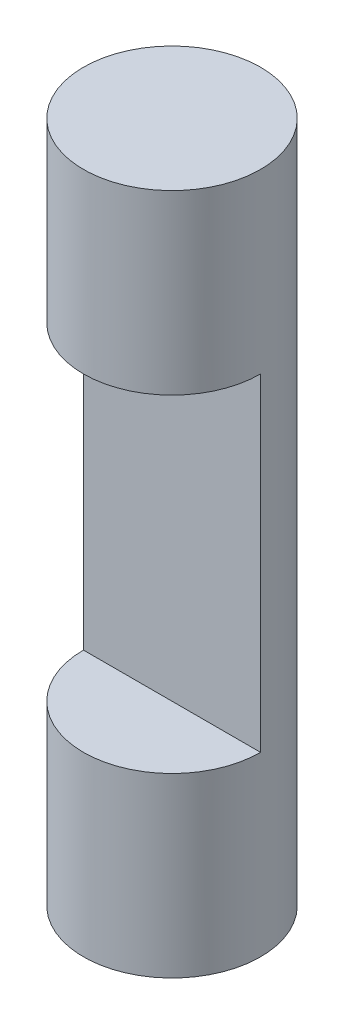
ISO-10303-21;
HEADER;
FILE_DESCRIPTION(('STEP AP214'),'2;1');
FILE_NAME('part.step','',(''),(''),'','','');
FILE_SCHEMA(('AUTOMOTIVE_DESIGN { 1 0 10303 214 1 1 1 1 }'));
ENDSEC;
DATA;
#1=APPLICATION_CONTEXT('core data for automotive mechanical design processes');
#2=APPLICATION_PROTOCOL_DEFINITION('international standard','automotive_design',2000,#1);
#3=PRODUCT_CONTEXT('',#1,'mechanical');
#4=PRODUCT('Part','Part','',(#3));
#5=PRODUCT_RELATED_PRODUCT_CATEGORY('part','',(#4));
#6=PRODUCT_DEFINITION_FORMATION('','',#4);
#7=PRODUCT_DEFINITION_CONTEXT('part definition',#1,'design');
#8=PRODUCT_DEFINITION('design','',#6,#7);
#9=PRODUCT_DEFINITION_SHAPE('','',#8);
#10=(LENGTH_UNIT() NAMED_UNIT(*) SI_UNIT(.MILLI.,.METRE.));
#11=(NAMED_UNIT(*) PLANE_ANGLE_UNIT() SI_UNIT($,.RADIAN.));
#12=(NAMED_UNIT(*) SI_UNIT($,.STERADIAN.) SOLID_ANGLE_UNIT());
#13=UNCERTAINTY_MEASURE_WITH_UNIT(LENGTH_MEASURE(1.E-05),#10,'distance_accuracy_value','');
#14=(GEOMETRIC_REPRESENTATION_CONTEXT(3) GLOBAL_UNCERTAINTY_ASSIGNED_CONTEXT((#13)) GLOBAL_UNIT_ASSIGNED_CONTEXT((#10,
#11,#12)) REPRESENTATION_CONTEXT('',''));
#15=CARTESIAN_POINT('',(0.,0.,0.));
#16=DIRECTION('',(0.,0.,1.));
#17=DIRECTION('',(1.,0.,0.));
#18=AXIS2_PLACEMENT_3D('',#15,#16,#17);
#19=CARTESIAN_POINT('',(0.,33.6284271247462,-11.));
#20=DIRECTION('',(0.,-1.,0.));
#21=DIRECTION('',(0.,0.,-1.));
#22=AXIS2_PLACEMENT_3D('',#19,#20,#21);
#23=CYLINDRICAL_SURFACE('',#22,1.);
#24=CARTESIAN_POINT('',(0.,6.7,-11.));
#25=DIRECTION('',(0.,-1.,0.));
#26=DIRECTION('',(0.,0.,-1.));
#27=AXIS2_PLACEMENT_3D('',#24,#25,#26);
#28=CIRCLE('',#27,1.);
#29=CARTESIAN_POINT('',(0.,6.7,-12.));
#30=VERTEX_POINT('',#29);
#31=EDGE_CURVE('E39',#30,#30,#28,.T.);
#32=ORIENTED_EDGE('',*,*,#31,.T.);
#33=EDGE_LOOP('',(#32));
#34=FACE_BOUND('',#33,.T.);
#35=CARTESIAN_POINT('',(0.,4.7,-11.));
#36=DIRECTION('',(0.,-1.,0.));
#37=DIRECTION('',(0.,0.,-1.));
#38=AXIS2_PLACEMENT_3D('',#35,#36,#37);
#39=CIRCLE('',#38,1.);
#40=CARTESIAN_POINT('',(1.,4.7,-11.));
#41=VERTEX_POINT('',#40);
#42=CARTESIAN_POINT('',(-1.,4.7,-11.));
#43=VERTEX_POINT('',#42);
#44=EDGE_CURVE('E66',#41,#43,#39,.T.);
#45=ORIENTED_EDGE('',*,*,#44,.F.);
#46=DIRECTION('',(0.,-1.,0.));
#47=VECTOR('',#46,1.);
#48=CARTESIAN_POINT('',(1.,33.6284271247462,-11.));
#49=LINE('',#48,#47);
#50=CARTESIAN_POINT('',(1.,1.,-11.));
#51=VERTEX_POINT('',#50);
#52=EDGE_CURVE('E12',#41,#51,#49,.T.);
#53=ORIENTED_EDGE('',*,*,#52,.T.);
#54=CARTESIAN_POINT('',(0.,1.,-11.));
#55=DIRECTION('',(0.,-1.,0.));
#56=DIRECTION('',(0.,0.,-1.));
#57=AXIS2_PLACEMENT_3D('',#54,#55,#56);
#58=CIRCLE('',#57,1.00000000000001);
#59=CARTESIAN_POINT('',(-1.00000000000001,1.,-11.));
#60=VERTEX_POINT('',#59);
#61=EDGE_CURVE('E71',#51,#60,#58,.T.);
#62=ORIENTED_EDGE('',*,*,#61,.T.);
#63=DIRECTION('',(0.,-1.,0.));
#64=VECTOR('',#63,1.);
#65=CARTESIAN_POINT('',(-1.,33.6284271247462,-11.));
#66=LINE('',#65,#64);
#67=EDGE_CURVE('E44',#60,#43,#66,.F.);
#68=ORIENTED_EDGE('',*,*,#67,.T.);
#69=EDGE_LOOP('',(#45,#53,#62,#68));
#70=FACE_BOUND('',#69,.T.);
#71=CARTESIAN_POINT('',(0.,-1.,-11.));
#72=DIRECTION('',(0.,-1.,0.));
#73=DIRECTION('',(0.,0.,-1.));
#74=AXIS2_PLACEMENT_3D('',#71,#72,#73);
#75=CIRCLE('',#74,1.00000000000001);
#76=CARTESIAN_POINT('',(0.,-1.,-12.));
#77=VERTEX_POINT('',#76);
#78=EDGE_CURVE('E74',#77,#77,#75,.T.);
#79=ORIENTED_EDGE('',*,*,#78,.F.);
#80=EDGE_LOOP('',(#79));
#81=FACE_BOUND('',#80,.T.);
#82=ADVANCED_FACE('F36',(#34,#70,#81),#23,.T.);
#83=CARTESIAN_POINT('',(-11.,1.,-11.));
#84=DIRECTION('',(0.,0.,-1.));
#85=DIRECTION('',(-1.,0.,0.));
#86=AXIS2_PLACEMENT_3D('',#83,#84,#85);
#87=PLANE('',#86);
#88=DIRECTION('',(-1.,0.,0.));
#89=VECTOR('',#88,1.);
#90=CARTESIAN_POINT('',(-11.,4.7,-11.));
#91=LINE('',#90,#89);
#92=EDGE_CURVE('E50',#41,#43,#91,.T.);
#93=ORIENTED_EDGE('',*,*,#92,.T.);
#94=ORIENTED_EDGE('',*,*,#67,.F.);
#95=DIRECTION('',(-1.,0.,0.));
#96=VECTOR('',#95,1.);
#97=CARTESIAN_POINT('',(-11.,1.,-11.));
#98=LINE('',#97,#96);
#99=EDGE_CURVE('E57',#51,#60,#98,.T.);
#100=ORIENTED_EDGE('',*,*,#99,.F.);
#101=ORIENTED_EDGE('',*,*,#52,.F.);
#102=EDGE_LOOP('',(#93,#94,#100,#101));
#103=FACE_BOUND('',#102,.T.);
#104=ADVANCED_FACE('F62',(#103),#87,.F.);
#105=CARTESIAN_POINT('',(0.,4.7,0.));
#106=DIRECTION('',(0.,-1.,0.));
#107=DIRECTION('',(0.,0.,-1.));
#108=AXIS2_PLACEMENT_3D('',#105,#106,#107);
#109=PLANE('',#108);
#110=ORIENTED_EDGE('',*,*,#44,.T.);
#111=ORIENTED_EDGE('',*,*,#92,.F.);
#112=EDGE_LOOP('',(#110,#111));
#113=FACE_BOUND('',#112,.T.);
#114=ADVANCED_FACE('F81',(#113),#109,.T.);
#115=CARTESIAN_POINT('',(0.,1.,-11.));
#116=DIRECTION('',(0.,-1.,0.));
#117=DIRECTION('',(0.,0.,-1.));
#118=AXIS2_PLACEMENT_3D('',#115,#116,#117);
#119=PLANE('',#118);
#120=ORIENTED_EDGE('',*,*,#61,.F.);
#121=ORIENTED_EDGE('',*,*,#99,.T.);
#122=EDGE_LOOP('',(#120,#121));
#123=FACE_BOUND('',#122,.T.);
#124=ADVANCED_FACE('F70',(#123),#119,.F.);
#125=CARTESIAN_POINT('',(0.,-1.,-11.));
#126=DIRECTION('',(0.,-1.,0.));
#127=DIRECTION('',(0.,0.,-1.));
#128=AXIS2_PLACEMENT_3D('',#125,#126,#127);
#129=PLANE('',#128);
#130=ORIENTED_EDGE('',*,*,#78,.T.);
#131=EDGE_LOOP('',(#130));
#132=FACE_BOUND('',#131,.T.);
#133=ADVANCED_FACE('F88',(#132),#129,.T.);
#134=CARTESIAN_POINT('',(0.,6.7,0.));
#135=DIRECTION('',(0.,-1.,0.));
#136=DIRECTION('',(0.,0.,-1.));
#137=AXIS2_PLACEMENT_3D('',#134,#135,#136);
#138=PLANE('',#137);
#139=ORIENTED_EDGE('',*,*,#31,.F.);
#140=EDGE_LOOP('',(#139));
#141=FACE_BOUND('',#140,.T.);
#142=ADVANCED_FACE('F96',(#141),#138,.F.);
#143=CLOSED_SHELL('',(#82,#104,#114,#124,#133,#142));
#144=MANIFOLD_SOLID_BREP('B2',#143);
#145=ADVANCED_BREP_SHAPE_REPRESENTATION('',(#18,#144),#14);
#146=SHAPE_DEFINITION_REPRESENTATION(#9,#145);
ENDSEC;
END-ISO-10303-21;
